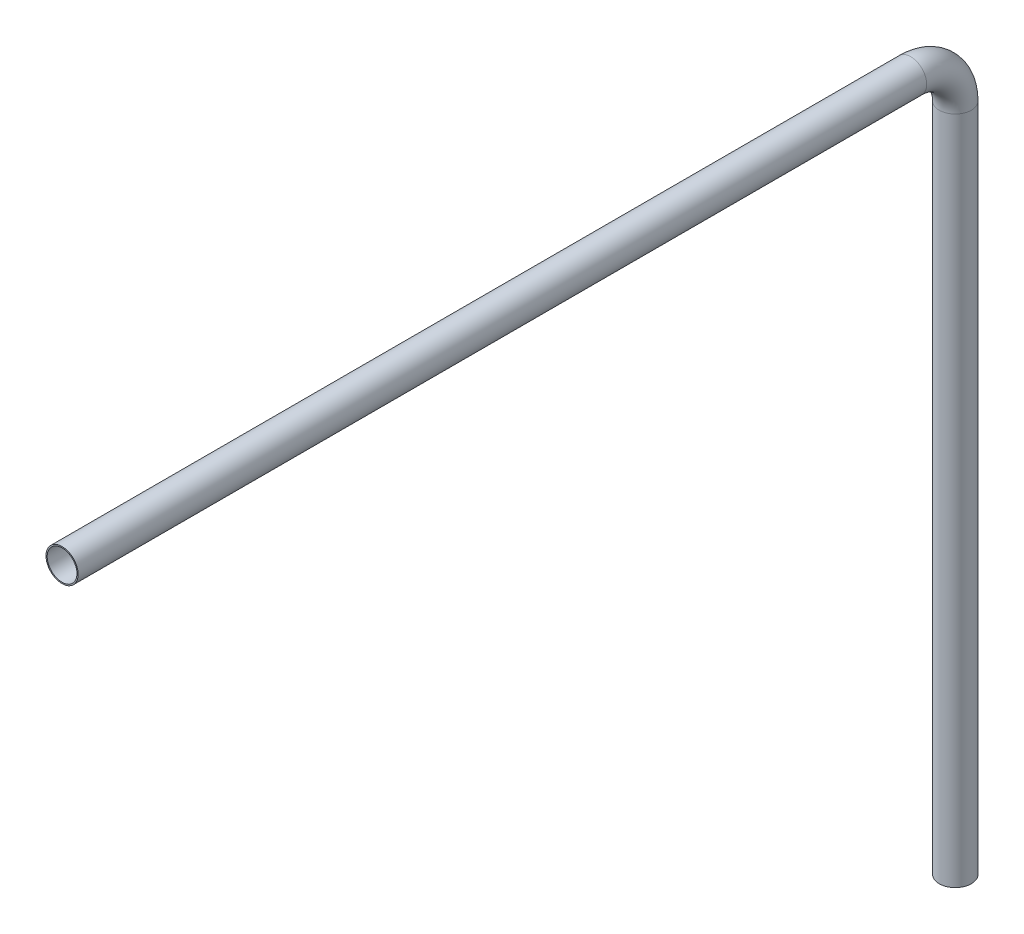
ISO-10303-21;
HEADER;
FILE_DESCRIPTION(('STEP AP214'),'2;1');
FILE_NAME('part.step','',(''),(''),'','','');
FILE_SCHEMA(('AUTOMOTIVE_DESIGN { 1 0 10303 214 1 1 1 1 }'));
ENDSEC;
DATA;
#1=APPLICATION_CONTEXT('core data for automotive mechanical design processes');
#2=APPLICATION_PROTOCOL_DEFINITION('international standard','automotive_design',2000,#1);
#3=PRODUCT_CONTEXT('',#1,'mechanical');
#4=PRODUCT('Part','Part','',(#3));
#5=PRODUCT_RELATED_PRODUCT_CATEGORY('part','',(#4));
#6=PRODUCT_DEFINITION_FORMATION('','',#4);
#7=PRODUCT_DEFINITION_CONTEXT('part definition',#1,'design');
#8=PRODUCT_DEFINITION('design','',#6,#7);
#9=PRODUCT_DEFINITION_SHAPE('','',#8);
#10=(LENGTH_UNIT() NAMED_UNIT(*) SI_UNIT(.MILLI.,.METRE.));
#11=(NAMED_UNIT(*) PLANE_ANGLE_UNIT() SI_UNIT($,.RADIAN.));
#12=(NAMED_UNIT(*) SI_UNIT($,.STERADIAN.) SOLID_ANGLE_UNIT());
#13=UNCERTAINTY_MEASURE_WITH_UNIT(LENGTH_MEASURE(1.E-05),#10,'distance_accuracy_value','');
#14=(GEOMETRIC_REPRESENTATION_CONTEXT(3) GLOBAL_UNCERTAINTY_ASSIGNED_CONTEXT((#13)) GLOBAL_UNIT_ASSIGNED_CONTEXT((#10,
#11,#12)) REPRESENTATION_CONTEXT('',''));
#15=CARTESIAN_POINT('',(0.,0.,0.));
#16=DIRECTION('',(0.,0.,1.));
#17=DIRECTION('',(1.,0.,0.));
#18=AXIS2_PLACEMENT_3D('',#15,#16,#17);
#19=CARTESIAN_POINT('',(0.,0.,0.));
#20=DIRECTION('',(0.,1.,0.));
#21=DIRECTION('',(0.,0.,1.));
#22=AXIS2_PLACEMENT_3D('',#19,#20,#21);
#23=CYLINDRICAL_SURFACE('',#22,54.);
#24=CARTESIAN_POINT('',(0.,1850.,0.));
#25=DIRECTION('',(0.,1.,0.));
#26=DIRECTION('',(0.,0.,1.));
#27=AXIS2_PLACEMENT_3D('',#24,#25,#26);
#28=CIRCLE('',#27,54.);
#29=CARTESIAN_POINT('',(0.,1850.,-54.));
#30=VERTEX_POINT('',#29);
#31=EDGE_CURVE('E59',#30,#30,#28,.T.);
#32=ORIENTED_EDGE('',*,*,#31,.F.);
#33=EDGE_LOOP('',(#32));
#34=FACE_BOUND('',#33,.T.);
#35=CARTESIAN_POINT('',(0.,-400.,0.));
#36=DIRECTION('',(0.,-1.,0.));
#37=DIRECTION('',(0.,0.,-1.));
#38=AXIS2_PLACEMENT_3D('',#35,#36,#37);
#39=CIRCLE('',#38,54.);
#40=CARTESIAN_POINT('',(0.,-400.,-54.));
#41=VERTEX_POINT('',#40);
#42=EDGE_CURVE('E58',#41,#41,#39,.T.);
#43=ORIENTED_EDGE('',*,*,#42,.F.);
#44=EDGE_LOOP('',(#43));
#45=FACE_BOUND('',#44,.T.);
#46=ADVANCED_FACE('F39',(#34,#45),#23,.T.);
#47=CARTESIAN_POINT('',(0.,1850.,150.));
#48=DIRECTION('',(1.,0.,0.));
#49=DIRECTION('',(0.,0.,-1.));
#50=AXIS2_PLACEMENT_3D('',#47,#48,#49);
#51=TOROIDAL_SURFACE('',#50,150.,54.);
#52=CARTESIAN_POINT('',(0.,2000.,150.000000000001));
#53=DIRECTION('',(0.,0.,1.));
#54=DIRECTION('',(0.,-1.,0.));
#55=AXIS2_PLACEMENT_3D('',#52,#53,#54);
#56=CIRCLE('',#55,54.);
#57=CARTESIAN_POINT('',(0.,2054.,150.000000000001));
#58=VERTEX_POINT('',#57);
#59=EDGE_CURVE('E43',#58,#58,#56,.T.);
#60=CARTESIAN_POINT('',(0.,1850.,150.));
#61=DIRECTION('',(1.,0.,0.));
#62=DIRECTION('',(0.,0.,-1.));
#63=AXIS2_PLACEMENT_3D('',#60,#61,#62);
#64=CIRCLE('',#63,204.);
#65=EDGE_CURVE('',#30,#58,#64,.T.);
#66=ORIENTED_EDGE('',*,*,#31,.T.);
#67=ORIENTED_EDGE('',*,*,#59,.F.);
#68=ORIENTED_EDGE('',*,*,#65,.T.);
#69=ORIENTED_EDGE('',*,*,#65,.F.);
#70=EDGE_LOOP('',(#66,#68,#67,#69));
#71=FACE_BOUND('',#70,.T.);
#72=ADVANCED_FACE('F93',(#71),#51,.T.);
#73=CARTESIAN_POINT('',(0.,2000.,150.000000000001));
#74=DIRECTION('',(0.,0.,1.));
#75=DIRECTION('',(0.,-1.,0.));
#76=AXIS2_PLACEMENT_3D('',#73,#74,#75);
#77=CYLINDRICAL_SURFACE('',#76,54.);
#78=CARTESIAN_POINT('',(0.,2000.,3000.));
#79=DIRECTION('',(0.,0.,1.));
#80=DIRECTION('',(0.,-1.,0.));
#81=AXIS2_PLACEMENT_3D('',#78,#79,#80);
#82=CIRCLE('',#81,54.);
#83=CARTESIAN_POINT('',(0.,1946.,3000.));
#84=VERTEX_POINT('',#83);
#85=EDGE_CURVE('E57',#84,#84,#82,.T.);
#86=ORIENTED_EDGE('',*,*,#85,.F.);
#87=EDGE_LOOP('',(#86));
#88=FACE_BOUND('',#87,.T.);
#89=ORIENTED_EDGE('',*,*,#59,.T.);
#90=EDGE_LOOP('',(#89));
#91=FACE_BOUND('',#90,.T.);
#92=ADVANCED_FACE('F41',(#88,#91),#77,.T.);
#93=CARTESIAN_POINT('',(0.,2000.,3000.));
#94=DIRECTION('',(0.,0.,1.));
#95=DIRECTION('',(0.,-1.,0.));
#96=AXIS2_PLACEMENT_3D('',#93,#94,#95);
#97=PLANE('',#96);
#98=CARTESIAN_POINT('',(0.,2000.,3000.));
#99=DIRECTION('',(0.,0.,1.));
#100=DIRECTION('',(0.,-1.,0.));
#101=AXIS2_PLACEMENT_3D('',#98,#99,#100);
#102=CIRCLE('',#101,50.);
#103=CARTESIAN_POINT('',(0.,1950.,3000.));
#104=VERTEX_POINT('',#103);
#105=EDGE_CURVE('E10',#104,#104,#102,.F.);
#106=ORIENTED_EDGE('',*,*,#105,.T.);
#107=EDGE_LOOP('',(#106));
#108=FACE_BOUND('',#107,.T.);
#109=ORIENTED_EDGE('',*,*,#85,.T.);
#110=EDGE_LOOP('',(#109));
#111=FACE_BOUND('',#110,.T.);
#112=ADVANCED_FACE('F80',(#108,#111),#97,.T.);
#113=CARTESIAN_POINT('',(0.,0.,0.));
#114=DIRECTION('',(0.,1.,0.));
#115=DIRECTION('',(0.,0.,1.));
#116=AXIS2_PLACEMENT_3D('',#113,#114,#115);
#117=CYLINDRICAL_SURFACE('',#116,50.);
#118=CARTESIAN_POINT('',(0.,1850.,0.));
#119=DIRECTION('',(0.,1.,0.));
#120=DIRECTION('',(0.,0.,1.));
#121=AXIS2_PLACEMENT_3D('',#118,#119,#120);
#122=CIRCLE('',#121,50.);
#123=CARTESIAN_POINT('',(0.,1850.,-50.));
#124=VERTEX_POINT('',#123);
#125=EDGE_CURVE('E55',#124,#124,#122,.F.);
#126=ORIENTED_EDGE('',*,*,#125,.F.);
#127=EDGE_LOOP('',(#126));
#128=FACE_BOUND('',#127,.T.);
#129=CARTESIAN_POINT('',(0.,-400.,0.));
#130=DIRECTION('',(0.,-1.,0.));
#131=DIRECTION('',(0.,0.,-1.));
#132=AXIS2_PLACEMENT_3D('',#129,#130,#131);
#133=CIRCLE('',#132,50.);
#134=CARTESIAN_POINT('',(0.,-400.,-50.));
#135=VERTEX_POINT('',#134);
#136=EDGE_CURVE('E61',#135,#135,#133,.T.);
#137=ORIENTED_EDGE('',*,*,#136,.T.);
#138=EDGE_LOOP('',(#137));
#139=FACE_BOUND('',#138,.T.);
#140=ADVANCED_FACE('F78',(#128,#139),#117,.F.);
#141=CARTESIAN_POINT('',(0.,1850.,150.));
#142=DIRECTION('',(1.,0.,0.));
#143=DIRECTION('',(0.,0.,-1.));
#144=AXIS2_PLACEMENT_3D('',#141,#142,#143);
#145=TOROIDAL_SURFACE('',#144,150.,50.);
#146=CARTESIAN_POINT('',(0.,2000.,150.000000000001));
#147=DIRECTION('',(0.,0.,1.));
#148=DIRECTION('',(0.,-1.,0.));
#149=AXIS2_PLACEMENT_3D('',#146,#147,#148);
#150=CIRCLE('',#149,50.);
#151=CARTESIAN_POINT('',(0.,2050.,150.000000000001));
#152=VERTEX_POINT('',#151);
#153=EDGE_CURVE('E50',#152,#152,#150,.F.);
#154=CARTESIAN_POINT('',(0.,1850.,150.));
#155=DIRECTION('',(1.,0.,0.));
#156=DIRECTION('',(0.,0.,-1.));
#157=AXIS2_PLACEMENT_3D('',#154,#155,#156);
#158=CIRCLE('',#157,200.);
#159=EDGE_CURVE('',#124,#152,#158,.T.);
#160=ORIENTED_EDGE('',*,*,#125,.T.);
#161=ORIENTED_EDGE('',*,*,#153,.F.);
#162=ORIENTED_EDGE('',*,*,#159,.T.);
#163=ORIENTED_EDGE('',*,*,#159,.F.);
#164=EDGE_LOOP('',(#160,#162,#161,#163));
#165=FACE_BOUND('',#164,.T.);
#166=ADVANCED_FACE('F74',(#165),#145,.F.);
#167=CARTESIAN_POINT('',(0.,2000.,150.000000000001));
#168=DIRECTION('',(0.,0.,1.));
#169=DIRECTION('',(0.,-1.,0.));
#170=AXIS2_PLACEMENT_3D('',#167,#168,#169);
#171=CYLINDRICAL_SURFACE('',#170,50.);
#172=ORIENTED_EDGE('',*,*,#105,.F.);
#173=EDGE_LOOP('',(#172));
#174=FACE_BOUND('',#173,.T.);
#175=ORIENTED_EDGE('',*,*,#153,.T.);
#176=EDGE_LOOP('',(#175));
#177=FACE_BOUND('',#176,.T.);
#178=ADVANCED_FACE('F82',(#174,#177),#171,.F.);
#179=CARTESIAN_POINT('',(0.,-400.,0.));
#180=DIRECTION('',(0.,-1.,0.));
#181=DIRECTION('',(0.,0.,-1.));
#182=AXIS2_PLACEMENT_3D('',#179,#180,#181);
#183=PLANE('',#182);
#184=ORIENTED_EDGE('',*,*,#42,.T.);
#185=EDGE_LOOP('',(#184));
#186=FACE_BOUND('',#185,.T.);
#187=ORIENTED_EDGE('',*,*,#136,.F.);
#188=EDGE_LOOP('',(#187));
#189=FACE_BOUND('',#188,.T.);
#190=ADVANCED_FACE('F81',(#186,#189),#183,.T.);
#191=CLOSED_SHELL('',(#46,#72,#92,#112,#140,#166,#178,#190));
#192=MANIFOLD_SOLID_BREP('B2',#191);
#193=ADVANCED_BREP_SHAPE_REPRESENTATION('',(#18,#192),#14);
#194=SHAPE_DEFINITION_REPRESENTATION(#9,#193);
ENDSEC;
END-ISO-10303-21;
